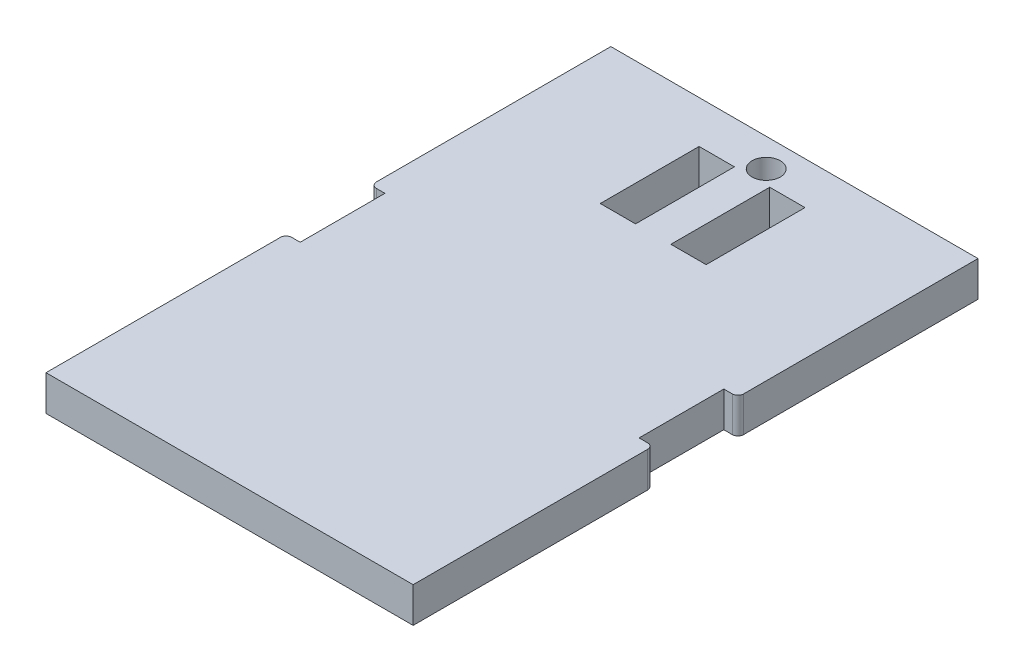
ISO-10303-21;
HEADER;
FILE_DESCRIPTION(('STEP AP214'),'2;1');
FILE_NAME('part.step','',(''),(''),'','','');
FILE_SCHEMA(('AUTOMOTIVE_DESIGN { 1 0 10303 214 1 1 1 1 }'));
ENDSEC;
DATA;
#1=APPLICATION_CONTEXT('core data for automotive mechanical design processes');
#2=APPLICATION_PROTOCOL_DEFINITION('international standard','automotive_design',2000,#1);
#3=PRODUCT_CONTEXT('',#1,'mechanical');
#4=PRODUCT('Part','Part','',(#3));
#5=PRODUCT_RELATED_PRODUCT_CATEGORY('part','',(#4));
#6=PRODUCT_DEFINITION_FORMATION('','',#4);
#7=PRODUCT_DEFINITION_CONTEXT('part definition',#1,'design');
#8=PRODUCT_DEFINITION('design','',#6,#7);
#9=PRODUCT_DEFINITION_SHAPE('','',#8);
#10=(LENGTH_UNIT() NAMED_UNIT(*) SI_UNIT(.MILLI.,.METRE.));
#11=(NAMED_UNIT(*) PLANE_ANGLE_UNIT() SI_UNIT($,.RADIAN.));
#12=(NAMED_UNIT(*) SI_UNIT($,.STERADIAN.) SOLID_ANGLE_UNIT());
#13=UNCERTAINTY_MEASURE_WITH_UNIT(LENGTH_MEASURE(1.E-05),#10,'distance_accuracy_value','');
#14=(GEOMETRIC_REPRESENTATION_CONTEXT(3) GLOBAL_UNCERTAINTY_ASSIGNED_CONTEXT((#13)) GLOBAL_UNIT_ASSIGNED_CONTEXT((#10,
#11,#12)) REPRESENTATION_CONTEXT('',''));
#15=CARTESIAN_POINT('',(0.,0.,0.));
#16=DIRECTION('',(0.,0.,1.));
#17=DIRECTION('',(1.,0.,0.));
#18=AXIS2_PLACEMENT_3D('',#15,#16,#17);
#19=CARTESIAN_POINT('',(33.02,3.175,0.));
#20=DIRECTION('',(-1.,0.,0.));
#21=DIRECTION('',(0.,0.,1.));
#22=AXIS2_PLACEMENT_3D('',#19,#20,#21);
#23=PLANE('',#22);
#24=DIRECTION('',(0.,0.,-1.));
#25=VECTOR('',#24,1.);
#26=CARTESIAN_POINT('',(33.02,0.,0.));
#27=LINE('',#26,#25);
#28=CARTESIAN_POINT('',(33.02,0.,0.));
#29=VERTEX_POINT('',#28);
#30=CARTESIAN_POINT('',(33.02,0.,-21.082));
#31=VERTEX_POINT('',#30);
#32=EDGE_CURVE('E344',#29,#31,#27,.T.);
#33=ORIENTED_EDGE('',*,*,#32,.T.);
#34=DIRECTION('',(0.,1.,0.));
#35=VECTOR('',#34,1.);
#36=CARTESIAN_POINT('',(33.02,3.175,-21.082));
#37=LINE('',#36,#35);
#38=CARTESIAN_POINT('',(33.02,3.175,-21.082));
#39=VERTEX_POINT('',#38);
#40=EDGE_CURVE('E360',#31,#39,#37,.T.);
#41=ORIENTED_EDGE('',*,*,#40,.T.);
#42=DIRECTION('',(0.,0.,-1.));
#43=VECTOR('',#42,1.);
#44=CARTESIAN_POINT('',(33.02,3.175,0.));
#45=LINE('',#44,#43);
#46=CARTESIAN_POINT('',(33.02,3.175,0.));
#47=VERTEX_POINT('',#46);
#48=EDGE_CURVE('E333',#47,#39,#45,.T.);
#49=ORIENTED_EDGE('',*,*,#48,.F.);
#50=DIRECTION('',(0.,-1.,0.));
#51=VECTOR('',#50,1.);
#52=CARTESIAN_POINT('',(33.02,3.175,0.));
#53=LINE('',#52,#51);
#54=EDGE_CURVE('E354',#47,#29,#53,.T.);
#55=ORIENTED_EDGE('',*,*,#54,.T.);
#56=EDGE_LOOP('',(#33,#41,#49,#55));
#57=FACE_BOUND('',#56,.T.);
#58=ADVANCED_FACE('F39',(#57),#23,.F.);
#59=CARTESIAN_POINT('',(0.,3.175,0.));
#60=DIRECTION('',(0.,-1.,0.));
#61=DIRECTION('',(0.,0.,-1.));
#62=AXIS2_PLACEMENT_3D('',#59,#60,#61);
#63=PLANE('',#62);
#64=ORIENTED_EDGE('',*,*,#48,.T.);
#65=CARTESIAN_POINT('',(32.512,3.175,-21.082));
#66=DIRECTION('',(0.,-1.,0.));
#67=DIRECTION('',(0.,0.,-1.));
#68=AXIS2_PLACEMENT_3D('',#65,#66,#67);
#69=CIRCLE('',#68,0.508);
#70=CARTESIAN_POINT('',(32.512,3.175,-21.59));
#71=VERTEX_POINT('',#70);
#72=EDGE_CURVE('E369',#39,#71,#69,.F.);
#73=ORIENTED_EDGE('',*,*,#72,.T.);
#74=DIRECTION('',(-1.,0.,0.));
#75=VECTOR('',#74,1.);
#76=CARTESIAN_POINT('',(33.02,3.175,-21.59));
#77=LINE('',#76,#75);
#78=CARTESIAN_POINT('',(31.75,3.175,-21.59));
#79=VERTEX_POINT('',#78);
#80=EDGE_CURVE('E213',#71,#79,#77,.T.);
#81=ORIENTED_EDGE('',*,*,#80,.T.);
#82=DIRECTION('',(0.,0.,1.));
#83=VECTOR('',#82,1.);
#84=CARTESIAN_POINT('',(31.75,3.175,-29.21));
#85=LINE('',#84,#83);
#86=CARTESIAN_POINT('',(31.75,3.175,-29.21));
#87=VERTEX_POINT('',#86);
#88=EDGE_CURVE('E233',#87,#79,#85,.T.);
#89=ORIENTED_EDGE('',*,*,#88,.F.);
#90=DIRECTION('',(-1.,0.,0.));
#91=VECTOR('',#90,1.);
#92=CARTESIAN_POINT('',(33.02,3.175,-29.21));
#93=LINE('',#92,#91);
#94=CARTESIAN_POINT('',(32.512,3.175,-29.21));
#95=VERTEX_POINT('',#94);
#96=EDGE_CURVE('E219',#95,#87,#93,.T.);
#97=ORIENTED_EDGE('',*,*,#96,.F.);
#98=CARTESIAN_POINT('',(32.512,3.175,-29.718));
#99=DIRECTION('',(0.,-1.,0.));
#100=DIRECTION('',(0.,0.,-1.));
#101=AXIS2_PLACEMENT_3D('',#98,#99,#100);
#102=CIRCLE('',#101,0.508);
#103=CARTESIAN_POINT('',(33.02,3.175,-29.718));
#104=VERTEX_POINT('',#103);
#105=EDGE_CURVE('E367',#95,#104,#102,.F.);
#106=ORIENTED_EDGE('',*,*,#105,.T.);
#107=CARTESIAN_POINT('',(33.02,3.175,-50.8));
#108=VERTEX_POINT('',#107);
#109=EDGE_CURVE('E332',#104,#108,#45,.T.);
#110=ORIENTED_EDGE('',*,*,#109,.T.);
#111=DIRECTION('',(-1.,0.,0.));
#112=VECTOR('',#111,1.);
#113=CARTESIAN_POINT('',(0.,3.175,-50.8));
#114=LINE('',#113,#112);
#115=CARTESIAN_POINT('',(0.,3.175,-50.8));
#116=VERTEX_POINT('',#115);
#117=EDGE_CURVE('E336',#108,#116,#114,.T.);
#118=ORIENTED_EDGE('',*,*,#117,.T.);
#119=DIRECTION('',(0.,0.,1.));
#120=VECTOR('',#119,1.);
#121=CARTESIAN_POINT('',(0.,3.175,0.));
#122=LINE('',#121,#120);
#123=CARTESIAN_POINT('',(0.,3.175,-29.718));
#124=VERTEX_POINT('',#123);
#125=EDGE_CURVE('E326',#116,#124,#122,.T.);
#126=ORIENTED_EDGE('',*,*,#125,.T.);
#127=CARTESIAN_POINT('',(0.508,3.175,-29.718));
#128=DIRECTION('',(0.,-1.,0.));
#129=DIRECTION('',(0.,0.,-1.));
#130=AXIS2_PLACEMENT_3D('',#127,#128,#129);
#131=CIRCLE('',#130,0.508);
#132=CARTESIAN_POINT('',(0.508,3.175,-29.21));
#133=VERTEX_POINT('',#132);
#134=EDGE_CURVE('E363',#124,#133,#131,.F.);
#135=ORIENTED_EDGE('',*,*,#134,.T.);
#136=DIRECTION('',(1.,0.,0.));
#137=VECTOR('',#136,1.);
#138=CARTESIAN_POINT('',(0.,3.175,-29.21));
#139=LINE('',#138,#137);
#140=CARTESIAN_POINT('',(1.27,3.175,-29.21));
#141=VERTEX_POINT('',#140);
#142=EDGE_CURVE('E236',#133,#141,#139,.T.);
#143=ORIENTED_EDGE('',*,*,#142,.T.);
#144=DIRECTION('',(0.,0.,1.));
#145=VECTOR('',#144,1.);
#146=CARTESIAN_POINT('',(1.27,3.175,-29.21));
#147=LINE('',#146,#145);
#148=CARTESIAN_POINT('',(1.27,3.175,-21.59));
#149=VERTEX_POINT('',#148);
#150=EDGE_CURVE('E248',#141,#149,#147,.T.);
#151=ORIENTED_EDGE('',*,*,#150,.T.);
#152=DIRECTION('',(1.,0.,0.));
#153=VECTOR('',#152,1.);
#154=CARTESIAN_POINT('',(0.,3.175,-21.59));
#155=LINE('',#154,#153);
#156=CARTESIAN_POINT('',(0.508,3.175,-21.59));
#157=VERTEX_POINT('',#156);
#158=EDGE_CURVE('E241',#157,#149,#155,.T.);
#159=ORIENTED_EDGE('',*,*,#158,.F.);
#160=CARTESIAN_POINT('',(0.508,3.175,-21.082));
#161=DIRECTION('',(0.,-1.,0.));
#162=DIRECTION('',(0.,0.,-1.));
#163=AXIS2_PLACEMENT_3D('',#160,#161,#162);
#164=CIRCLE('',#163,0.508);
#165=CARTESIAN_POINT('',(0.,3.175,-21.082));
#166=VERTEX_POINT('',#165);
#167=EDGE_CURVE('E365',#157,#166,#164,.F.);
#168=ORIENTED_EDGE('',*,*,#167,.T.);
#169=CARTESIAN_POINT('',(0.,3.175,0.));
#170=VERTEX_POINT('',#169);
#171=EDGE_CURVE('E330',#166,#170,#122,.T.);
#172=ORIENTED_EDGE('',*,*,#171,.T.);
#173=DIRECTION('',(1.,0.,0.));
#174=VECTOR('',#173,1.);
#175=CARTESIAN_POINT('',(0.,3.175,0.));
#176=LINE('',#175,#174);
#177=EDGE_CURVE('E329',#170,#47,#176,.T.);
#178=ORIENTED_EDGE('',*,*,#177,.T.);
#179=EDGE_LOOP('',(#64,#73,#81,#89,#97,#106,#110,#118,#126,#135,#143,#151,#159,#168,#172,#178));
#180=FACE_BOUND('',#179,.T.);
#181=DIRECTION('',(0.,0.,1.));
#182=VECTOR('',#181,1.);
#183=CARTESIAN_POINT('',(18.0975,3.175,-46.99));
#184=LINE('',#183,#182);
#185=CARTESIAN_POINT('',(18.0975,3.175,-46.99));
#186=VERTEX_POINT('',#185);
#187=CARTESIAN_POINT('',(18.0975,3.175,-38.1));
#188=VERTEX_POINT('',#187);
#189=EDGE_CURVE('E264',#186,#188,#184,.T.);
#190=ORIENTED_EDGE('',*,*,#189,.F.);
#191=DIRECTION('',(-1.,0.,0.));
#192=VECTOR('',#191,1.);
#193=CARTESIAN_POINT('',(18.0975,3.175,-46.99));
#194=LINE('',#193,#192);
#195=CARTESIAN_POINT('',(21.2725,3.175,-46.99));
#196=VERTEX_POINT('',#195);
#197=EDGE_CURVE('E272',#196,#186,#194,.T.);
#198=ORIENTED_EDGE('',*,*,#197,.F.);
#199=DIRECTION('',(0.,0.,-1.));
#200=VECTOR('',#199,1.);
#201=CARTESIAN_POINT('',(21.2725,3.175,-46.99));
#202=LINE('',#201,#200);
#203=CARTESIAN_POINT('',(21.2725,3.175,-38.1));
#204=VERTEX_POINT('',#203);
#205=EDGE_CURVE('E269',#204,#196,#202,.T.);
#206=ORIENTED_EDGE('',*,*,#205,.F.);
#207=DIRECTION('',(1.,0.,0.));
#208=VECTOR('',#207,1.);
#209=CARTESIAN_POINT('',(18.0975,3.175,-38.1));
#210=LINE('',#209,#208);
#211=EDGE_CURVE('E266',#188,#204,#210,.T.);
#212=ORIENTED_EDGE('',*,*,#211,.F.);
#213=EDGE_LOOP('',(#190,#198,#206,#212));
#214=FACE_BOUND('',#213,.T.);
#215=DIRECTION('',(0.,0.,1.));
#216=VECTOR('',#215,1.);
#217=CARTESIAN_POINT('',(11.7475,3.175,-46.99));
#218=LINE('',#217,#216);
#219=CARTESIAN_POINT('',(11.7475,3.175,-46.99));
#220=VERTEX_POINT('',#219);
#221=CARTESIAN_POINT('',(11.7475,3.175,-38.1));
#222=VERTEX_POINT('',#221);
#223=EDGE_CURVE('E295',#220,#222,#218,.T.);
#224=ORIENTED_EDGE('',*,*,#223,.F.);
#225=DIRECTION('',(-1.,0.,0.));
#226=VECTOR('',#225,1.);
#227=CARTESIAN_POINT('',(11.7475,3.175,-46.99));
#228=LINE('',#227,#226);
#229=CARTESIAN_POINT('',(14.9225,3.175,-46.99));
#230=VERTEX_POINT('',#229);
#231=EDGE_CURVE('E303',#230,#220,#228,.T.);
#232=ORIENTED_EDGE('',*,*,#231,.F.);
#233=DIRECTION('',(0.,0.,-1.));
#234=VECTOR('',#233,1.);
#235=CARTESIAN_POINT('',(14.9225,3.175,-46.99));
#236=LINE('',#235,#234);
#237=CARTESIAN_POINT('',(14.9225,3.175,-38.1));
#238=VERTEX_POINT('',#237);
#239=EDGE_CURVE('E300',#238,#230,#236,.T.);
#240=ORIENTED_EDGE('',*,*,#239,.F.);
#241=DIRECTION('',(1.,0.,0.));
#242=VECTOR('',#241,1.);
#243=CARTESIAN_POINT('',(11.7475,3.175,-38.1));
#244=LINE('',#243,#242);
#245=EDGE_CURVE('E297',#222,#238,#244,.T.);
#246=ORIENTED_EDGE('',*,*,#245,.F.);
#247=EDGE_LOOP('',(#224,#232,#240,#246));
#248=FACE_BOUND('',#247,.T.);
#249=CARTESIAN_POINT('',(16.51,3.175,-48.26));
#250=DIRECTION('',(0.,1.,0.));
#251=DIRECTION('',(0.,0.,1.));
#252=AXIS2_PLACEMENT_3D('',#249,#250,#251);
#253=CIRCLE('',#252,1.27);
#254=CARTESIAN_POINT('',(16.51,3.175,-46.99));
#255=VERTEX_POINT('',#254);
#256=EDGE_CURVE('E257',#255,#255,#253,.T.);
#257=ORIENTED_EDGE('',*,*,#256,.F.);
#258=EDGE_LOOP('',(#257));
#259=FACE_BOUND('',#258,.T.);
#260=ADVANCED_FACE('F393',(#180,#214,#248,#259),#63,.F.);
#261=CARTESIAN_POINT('',(0.,0.,0.));
#262=DIRECTION('',(0.,-1.,0.));
#263=DIRECTION('',(0.,0.,-1.));
#264=AXIS2_PLACEMENT_3D('',#261,#262,#263);
#265=PLANE('',#264);
#266=DIRECTION('',(-1.,0.,0.));
#267=VECTOR('',#266,1.);
#268=CARTESIAN_POINT('',(33.02,0.,-21.59));
#269=LINE('',#268,#267);
#270=CARTESIAN_POINT('',(32.512,0.,-21.59));
#271=VERTEX_POINT('',#270);
#272=CARTESIAN_POINT('',(31.75,0.,-21.59));
#273=VERTEX_POINT('',#272);
#274=EDGE_CURVE('E224',#271,#273,#269,.T.);
#275=ORIENTED_EDGE('',*,*,#274,.F.);
#276=CARTESIAN_POINT('',(32.512,0.,-21.082));
#277=DIRECTION('',(0.,-1.,0.));
#278=DIRECTION('',(0.,0.,-1.));
#279=AXIS2_PLACEMENT_3D('',#276,#277,#278);
#280=CIRCLE('',#279,0.508);
#281=EDGE_CURVE('E377',#271,#31,#280,.T.);
#282=ORIENTED_EDGE('',*,*,#281,.T.);
#283=ORIENTED_EDGE('',*,*,#32,.F.);
#284=DIRECTION('',(1.,0.,0.));
#285=VECTOR('',#284,1.);
#286=CARTESIAN_POINT('',(0.,0.,0.));
#287=LINE('',#286,#285);
#288=CARTESIAN_POINT('',(0.,0.,0.));
#289=VERTEX_POINT('',#288);
#290=EDGE_CURVE('E341',#289,#29,#287,.T.);
#291=ORIENTED_EDGE('',*,*,#290,.F.);
#292=DIRECTION('',(0.,0.,1.));
#293=VECTOR('',#292,1.);
#294=CARTESIAN_POINT('',(0.,0.,0.));
#295=LINE('',#294,#293);
#296=CARTESIAN_POINT('',(0.,0.,-21.082));
#297=VERTEX_POINT('',#296);
#298=EDGE_CURVE('E325',#297,#289,#295,.T.);
#299=ORIENTED_EDGE('',*,*,#298,.F.);
#300=CARTESIAN_POINT('',(0.508,0.,-21.082));
#301=DIRECTION('',(0.,-1.,0.));
#302=DIRECTION('',(0.,0.,-1.));
#303=AXIS2_PLACEMENT_3D('',#300,#301,#302);
#304=CIRCLE('',#303,0.508);
#305=CARTESIAN_POINT('',(0.508,0.,-21.59));
#306=VERTEX_POINT('',#305);
#307=EDGE_CURVE('E374',#297,#306,#304,.T.);
#308=ORIENTED_EDGE('',*,*,#307,.T.);
#309=DIRECTION('',(1.,0.,0.));
#310=VECTOR('',#309,1.);
#311=CARTESIAN_POINT('',(0.,0.,-21.59));
#312=LINE('',#311,#310);
#313=CARTESIAN_POINT('',(1.27,0.,-21.59));
#314=VERTEX_POINT('',#313);
#315=EDGE_CURVE('E244',#306,#314,#312,.T.);
#316=ORIENTED_EDGE('',*,*,#315,.T.);
#317=DIRECTION('',(0.,0.,1.));
#318=VECTOR('',#317,1.);
#319=CARTESIAN_POINT('',(1.27,0.,-29.21));
#320=LINE('',#319,#318);
#321=CARTESIAN_POINT('',(1.27,0.,-29.21));
#322=VERTEX_POINT('',#321);
#323=EDGE_CURVE('E240',#322,#314,#320,.T.);
#324=ORIENTED_EDGE('',*,*,#323,.F.);
#325=DIRECTION('',(1.,0.,0.));
#326=VECTOR('',#325,1.);
#327=CARTESIAN_POINT('',(0.,0.,-29.21));
#328=LINE('',#327,#326);
#329=CARTESIAN_POINT('',(0.508,0.,-29.21));
#330=VERTEX_POINT('',#329);
#331=EDGE_CURVE('E238',#330,#322,#328,.T.);
#332=ORIENTED_EDGE('',*,*,#331,.F.);
#333=CARTESIAN_POINT('',(0.508,0.,-29.718));
#334=DIRECTION('',(0.,-1.,0.));
#335=DIRECTION('',(0.,0.,-1.));
#336=AXIS2_PLACEMENT_3D('',#333,#334,#335);
#337=CIRCLE('',#336,0.508);
#338=CARTESIAN_POINT('',(0.,0.,-29.718));
#339=VERTEX_POINT('',#338);
#340=EDGE_CURVE('E62',#330,#339,#337,.T.);
#341=ORIENTED_EDGE('',*,*,#340,.T.);
#342=CARTESIAN_POINT('',(0.,0.,-50.8));
#343=VERTEX_POINT('',#342);
#344=EDGE_CURVE('E339',#343,#339,#295,.T.);
#345=ORIENTED_EDGE('',*,*,#344,.F.);
#346=DIRECTION('',(-1.,0.,0.));
#347=VECTOR('',#346,1.);
#348=CARTESIAN_POINT('',(0.,0.,-50.8));
#349=LINE('',#348,#347);
#350=CARTESIAN_POINT('',(33.02,0.,-50.8));
#351=VERTEX_POINT('',#350);
#352=EDGE_CURVE('E347',#351,#343,#349,.T.);
#353=ORIENTED_EDGE('',*,*,#352,.F.);
#354=CARTESIAN_POINT('',(33.02,0.,-29.718));
#355=VERTEX_POINT('',#354);
#356=EDGE_CURVE('E343',#355,#351,#27,.T.);
#357=ORIENTED_EDGE('',*,*,#356,.F.);
#358=CARTESIAN_POINT('',(32.512,0.,-29.718));
#359=DIRECTION('',(0.,-1.,0.));
#360=DIRECTION('',(0.,0.,-1.));
#361=AXIS2_PLACEMENT_3D('',#358,#359,#360);
#362=CIRCLE('',#361,0.508);
#363=CARTESIAN_POINT('',(32.512,0.,-29.21));
#364=VERTEX_POINT('',#363);
#365=EDGE_CURVE('E209',#355,#364,#362,.T.);
#366=ORIENTED_EDGE('',*,*,#365,.T.);
#367=DIRECTION('',(-1.,0.,0.));
#368=VECTOR('',#367,1.);
#369=CARTESIAN_POINT('',(33.02,0.,-29.21));
#370=LINE('',#369,#368);
#371=CARTESIAN_POINT('',(31.75,0.,-29.21));
#372=VERTEX_POINT('',#371);
#373=EDGE_CURVE('E201',#364,#372,#370,.T.);
#374=ORIENTED_EDGE('',*,*,#373,.T.);
#375=DIRECTION('',(0.,0.,1.));
#376=VECTOR('',#375,1.);
#377=CARTESIAN_POINT('',(31.75,0.,-29.21));
#378=LINE('',#377,#376);
#379=EDGE_CURVE('E207',#372,#273,#378,.T.);
#380=ORIENTED_EDGE('',*,*,#379,.T.);
#381=EDGE_LOOP('',(#275,#282,#283,#291,#299,#308,#316,#324,#332,#341,#345,#353,#357,#366,#374,#380));
#382=FACE_BOUND('',#381,.T.);
#383=CARTESIAN_POINT('',(16.51,0.,-48.26));
#384=DIRECTION('',(0.,1.,0.));
#385=DIRECTION('',(0.,0.,1.));
#386=AXIS2_PLACEMENT_3D('',#383,#384,#385);
#387=CIRCLE('',#386,1.27);
#388=CARTESIAN_POINT('',(16.51,0.,-46.99));
#389=VERTEX_POINT('',#388);
#390=EDGE_CURVE('E258',#389,#389,#387,.T.);
#391=ORIENTED_EDGE('',*,*,#390,.T.);
#392=EDGE_LOOP('',(#391));
#393=FACE_BOUND('',#392,.T.);
#394=DIRECTION('',(-1.,0.,0.));
#395=VECTOR('',#394,1.);
#396=CARTESIAN_POINT('',(11.7475,0.,-46.99));
#397=LINE('',#396,#395);
#398=CARTESIAN_POINT('',(14.9225,0.,-46.99));
#399=VERTEX_POINT('',#398);
#400=CARTESIAN_POINT('',(11.7475,0.,-46.99));
#401=VERTEX_POINT('',#400);
#402=EDGE_CURVE('E298',#399,#401,#397,.T.);
#403=ORIENTED_EDGE('',*,*,#402,.T.);
#404=DIRECTION('',(0.,0.,1.));
#405=VECTOR('',#404,1.);
#406=CARTESIAN_POINT('',(11.7475,0.,-46.99));
#407=LINE('',#406,#405);
#408=CARTESIAN_POINT('',(11.7475,0.,-38.1));
#409=VERTEX_POINT('',#408);
#410=EDGE_CURVE('E294',#401,#409,#407,.T.);
#411=ORIENTED_EDGE('',*,*,#410,.T.);
#412=DIRECTION('',(1.,0.,0.));
#413=VECTOR('',#412,1.);
#414=CARTESIAN_POINT('',(11.7475,0.,-38.1));
#415=LINE('',#414,#413);
#416=CARTESIAN_POINT('',(14.9225,0.,-38.1));
#417=VERTEX_POINT('',#416);
#418=EDGE_CURVE('E308',#409,#417,#415,.T.);
#419=ORIENTED_EDGE('',*,*,#418,.T.);
#420=DIRECTION('',(0.,0.,-1.));
#421=VECTOR('',#420,1.);
#422=CARTESIAN_POINT('',(14.9225,0.,-46.99));
#423=LINE('',#422,#421);
#424=EDGE_CURVE('E311',#417,#399,#423,.T.);
#425=ORIENTED_EDGE('',*,*,#424,.T.);
#426=EDGE_LOOP('',(#403,#411,#419,#425));
#427=FACE_BOUND('',#426,.T.);
#428=DIRECTION('',(-1.,0.,0.));
#429=VECTOR('',#428,1.);
#430=CARTESIAN_POINT('',(18.0975,0.,-46.99));
#431=LINE('',#430,#429);
#432=CARTESIAN_POINT('',(21.2725,0.,-46.99));
#433=VERTEX_POINT('',#432);
#434=CARTESIAN_POINT('',(18.0975,0.,-46.99));
#435=VERTEX_POINT('',#434);
#436=EDGE_CURVE('E267',#433,#435,#431,.T.);
#437=ORIENTED_EDGE('',*,*,#436,.T.);
#438=DIRECTION('',(0.,0.,1.));
#439=VECTOR('',#438,1.);
#440=CARTESIAN_POINT('',(18.0975,0.,-46.99));
#441=LINE('',#440,#439);
#442=CARTESIAN_POINT('',(18.0975,0.,-38.1));
#443=VERTEX_POINT('',#442);
#444=EDGE_CURVE('E261',#435,#443,#441,.T.);
#445=ORIENTED_EDGE('',*,*,#444,.T.);
#446=DIRECTION('',(1.,0.,0.));
#447=VECTOR('',#446,1.);
#448=CARTESIAN_POINT('',(18.0975,0.,-38.1));
#449=LINE('',#448,#447);
#450=CARTESIAN_POINT('',(21.2725,0.,-38.1));
#451=VERTEX_POINT('',#450);
#452=EDGE_CURVE('E277',#443,#451,#449,.T.);
#453=ORIENTED_EDGE('',*,*,#452,.T.);
#454=DIRECTION('',(0.,0.,-1.));
#455=VECTOR('',#454,1.);
#456=CARTESIAN_POINT('',(21.2725,0.,-46.99));
#457=LINE('',#456,#455);
#458=EDGE_CURVE('E280',#451,#433,#457,.T.);
#459=ORIENTED_EDGE('',*,*,#458,.T.);
#460=EDGE_LOOP('',(#437,#445,#453,#459));
#461=FACE_BOUND('',#460,.T.);
#462=ADVANCED_FACE('F204',(#382,#393,#427,#461),#265,.T.);
#463=CARTESIAN_POINT('',(0.,3.175,0.));
#464=DIRECTION('',(1.,0.,0.));
#465=DIRECTION('',(0.,0.,-1.));
#466=AXIS2_PLACEMENT_3D('',#463,#464,#465);
#467=PLANE('',#466);
#468=ORIENTED_EDGE('',*,*,#344,.T.);
#469=DIRECTION('',(0.,1.,0.));
#470=VECTOR('',#469,1.);
#471=CARTESIAN_POINT('',(0.,3.175,-29.718));
#472=LINE('',#471,#470);
#473=EDGE_CURVE('E47',#339,#124,#472,.T.);
#474=ORIENTED_EDGE('',*,*,#473,.T.);
#475=ORIENTED_EDGE('',*,*,#125,.F.);
#476=DIRECTION('',(0.,-1.,0.));
#477=VECTOR('',#476,1.);
#478=CARTESIAN_POINT('',(0.,3.175,-50.8));
#479=LINE('',#478,#477);
#480=EDGE_CURVE('E338',#116,#343,#479,.T.);
#481=ORIENTED_EDGE('',*,*,#480,.T.);
#482=EDGE_LOOP('',(#468,#474,#475,#481));
#483=FACE_BOUND('',#482,.T.);
#484=ADVANCED_FACE('F390',(#483),#467,.F.);
#485=ORIENTED_EDGE('',*,*,#171,.F.);
#486=DIRECTION('',(0.,1.,0.));
#487=VECTOR('',#486,1.);
#488=CARTESIAN_POINT('',(0.,3.175,-21.082));
#489=LINE('',#488,#487);
#490=EDGE_CURVE('E385',#166,#297,#489,.F.);
#491=ORIENTED_EDGE('',*,*,#490,.T.);
#492=ORIENTED_EDGE('',*,*,#298,.T.);
#493=DIRECTION('',(0.,-1.,0.));
#494=VECTOR('',#493,1.);
#495=CARTESIAN_POINT('',(0.,3.175,0.));
#496=LINE('',#495,#494);
#497=EDGE_CURVE('E357',#170,#289,#496,.T.);
#498=ORIENTED_EDGE('',*,*,#497,.F.);
#499=EDGE_LOOP('',(#485,#491,#492,#498));
#500=FACE_BOUND('',#499,.T.);
#501=ADVANCED_FACE('F425',(#500),#467,.F.);
#502=CARTESIAN_POINT('',(0.,3.175,0.));
#503=DIRECTION('',(0.,0.,-1.));
#504=DIRECTION('',(-1.,0.,0.));
#505=AXIS2_PLACEMENT_3D('',#502,#503,#504);
#506=PLANE('',#505);
#507=ORIENTED_EDGE('',*,*,#290,.T.);
#508=ORIENTED_EDGE('',*,*,#54,.F.);
#509=ORIENTED_EDGE('',*,*,#177,.F.);
#510=ORIENTED_EDGE('',*,*,#497,.T.);
#511=EDGE_LOOP('',(#507,#508,#509,#510));
#512=FACE_BOUND('',#511,.T.);
#513=ADVANCED_FACE('F420',(#512),#506,.F.);
#514=ORIENTED_EDGE('',*,*,#109,.F.);
#515=DIRECTION('',(0.,1.,0.));
#516=VECTOR('',#515,1.);
#517=CARTESIAN_POINT('',(33.02,3.175,-29.718));
#518=LINE('',#517,#516);
#519=EDGE_CURVE('E54',#104,#355,#518,.F.);
#520=ORIENTED_EDGE('',*,*,#519,.T.);
#521=ORIENTED_EDGE('',*,*,#356,.T.);
#522=DIRECTION('',(0.,-1.,0.));
#523=VECTOR('',#522,1.);
#524=CARTESIAN_POINT('',(33.02,3.175,-50.8));
#525=LINE('',#524,#523);
#526=EDGE_CURVE('E351',#108,#351,#525,.T.);
#527=ORIENTED_EDGE('',*,*,#526,.F.);
#528=EDGE_LOOP('',(#514,#520,#521,#527));
#529=FACE_BOUND('',#528,.T.);
#530=ADVANCED_FACE('F449',(#529),#23,.F.);
#531=CARTESIAN_POINT('',(0.,3.175,-50.8));
#532=DIRECTION('',(0.,0.,1.));
#533=DIRECTION('',(1.,0.,0.));
#534=AXIS2_PLACEMENT_3D('',#531,#532,#533);
#535=PLANE('',#534);
#536=ORIENTED_EDGE('',*,*,#352,.T.);
#537=ORIENTED_EDGE('',*,*,#480,.F.);
#538=ORIENTED_EDGE('',*,*,#117,.F.);
#539=ORIENTED_EDGE('',*,*,#526,.T.);
#540=EDGE_LOOP('',(#536,#537,#538,#539));
#541=FACE_BOUND('',#540,.T.);
#542=ADVANCED_FACE('F400',(#541),#535,.F.);
#543=CARTESIAN_POINT('',(11.7475,3.175,-46.99));
#544=DIRECTION('',(1.,0.,0.));
#545=DIRECTION('',(0.,0.,-1.));
#546=AXIS2_PLACEMENT_3D('',#543,#544,#545);
#547=PLANE('',#546);
#548=ORIENTED_EDGE('',*,*,#410,.F.);
#549=DIRECTION('',(0.,-1.,0.));
#550=VECTOR('',#549,1.);
#551=CARTESIAN_POINT('',(11.7475,3.175,-46.99));
#552=LINE('',#551,#550);
#553=EDGE_CURVE('E305',#220,#401,#552,.T.);
#554=ORIENTED_EDGE('',*,*,#553,.F.);
#555=ORIENTED_EDGE('',*,*,#223,.T.);
#556=DIRECTION('',(0.,-1.,0.));
#557=VECTOR('',#556,1.);
#558=CARTESIAN_POINT('',(11.7475,3.175,-38.1));
#559=LINE('',#558,#557);
#560=EDGE_CURVE('E322',#222,#409,#559,.T.);
#561=ORIENTED_EDGE('',*,*,#560,.T.);
#562=EDGE_LOOP('',(#548,#554,#555,#561));
#563=FACE_BOUND('',#562,.T.);
#564=ADVANCED_FACE('F463',(#563),#547,.T.);
#565=CARTESIAN_POINT('',(11.7475,3.175,-38.1));
#566=DIRECTION('',(0.,0.,-1.));
#567=DIRECTION('',(-1.,0.,0.));
#568=AXIS2_PLACEMENT_3D('',#565,#566,#567);
#569=PLANE('',#568);
#570=ORIENTED_EDGE('',*,*,#418,.F.);
#571=ORIENTED_EDGE('',*,*,#560,.F.);
#572=ORIENTED_EDGE('',*,*,#245,.T.);
#573=DIRECTION('',(0.,-1.,0.));
#574=VECTOR('',#573,1.);
#575=CARTESIAN_POINT('',(14.9225,3.175,-38.1));
#576=LINE('',#575,#574);
#577=EDGE_CURVE('E320',#238,#417,#576,.T.);
#578=ORIENTED_EDGE('',*,*,#577,.T.);
#579=EDGE_LOOP('',(#570,#571,#572,#578));
#580=FACE_BOUND('',#579,.T.);
#581=ADVANCED_FACE('F618',(#580),#569,.T.);
#582=CARTESIAN_POINT('',(14.9225,3.175,-46.99));
#583=DIRECTION('',(-1.,0.,0.));
#584=DIRECTION('',(0.,0.,1.));
#585=AXIS2_PLACEMENT_3D('',#582,#583,#584);
#586=PLANE('',#585);
#587=ORIENTED_EDGE('',*,*,#424,.F.);
#588=ORIENTED_EDGE('',*,*,#577,.F.);
#589=ORIENTED_EDGE('',*,*,#239,.T.);
#590=DIRECTION('',(0.,-1.,0.));
#591=VECTOR('',#590,1.);
#592=CARTESIAN_POINT('',(14.9225,3.175,-46.99));
#593=LINE('',#592,#591);
#594=EDGE_CURVE('E318',#230,#399,#593,.T.);
#595=ORIENTED_EDGE('',*,*,#594,.T.);
#596=EDGE_LOOP('',(#587,#588,#589,#595));
#597=FACE_BOUND('',#596,.T.);
#598=ADVANCED_FACE('F609',(#597),#586,.T.);
#599=CARTESIAN_POINT('',(11.7475,3.175,-46.99));
#600=DIRECTION('',(0.,0.,1.));
#601=DIRECTION('',(1.,0.,0.));
#602=AXIS2_PLACEMENT_3D('',#599,#600,#601);
#603=PLANE('',#602);
#604=ORIENTED_EDGE('',*,*,#402,.F.);
#605=ORIENTED_EDGE('',*,*,#594,.F.);
#606=ORIENTED_EDGE('',*,*,#231,.T.);
#607=ORIENTED_EDGE('',*,*,#553,.T.);
#608=EDGE_LOOP('',(#604,#605,#606,#607));
#609=FACE_BOUND('',#608,.T.);
#610=ADVANCED_FACE('F600',(#609),#603,.T.);
#611=CARTESIAN_POINT('',(18.0975,3.175,-46.99));
#612=DIRECTION('',(1.,0.,0.));
#613=DIRECTION('',(0.,0.,-1.));
#614=AXIS2_PLACEMENT_3D('',#611,#612,#613);
#615=PLANE('',#614);
#616=ORIENTED_EDGE('',*,*,#444,.F.);
#617=DIRECTION('',(0.,-1.,0.));
#618=VECTOR('',#617,1.);
#619=CARTESIAN_POINT('',(18.0975,3.175,-46.99));
#620=LINE('',#619,#618);
#621=EDGE_CURVE('E274',#186,#435,#620,.T.);
#622=ORIENTED_EDGE('',*,*,#621,.F.);
#623=ORIENTED_EDGE('',*,*,#189,.T.);
#624=DIRECTION('',(0.,-1.,0.));
#625=VECTOR('',#624,1.);
#626=CARTESIAN_POINT('',(18.0975,3.175,-38.1));
#627=LINE('',#626,#625);
#628=EDGE_CURVE('E291',#188,#443,#627,.T.);
#629=ORIENTED_EDGE('',*,*,#628,.T.);
#630=EDGE_LOOP('',(#616,#622,#623,#629));
#631=FACE_BOUND('',#630,.T.);
#632=ADVANCED_FACE('F591',(#631),#615,.T.);
#633=CARTESIAN_POINT('',(18.0975,3.175,-38.1));
#634=DIRECTION('',(0.,0.,-1.));
#635=DIRECTION('',(-1.,0.,0.));
#636=AXIS2_PLACEMENT_3D('',#633,#634,#635);
#637=PLANE('',#636);
#638=ORIENTED_EDGE('',*,*,#452,.F.);
#639=ORIENTED_EDGE('',*,*,#628,.F.);
#640=ORIENTED_EDGE('',*,*,#211,.T.);
#641=DIRECTION('',(0.,-1.,0.));
#642=VECTOR('',#641,1.);
#643=CARTESIAN_POINT('',(21.2725,3.175,-38.1));
#644=LINE('',#643,#642);
#645=EDGE_CURVE('E289',#204,#451,#644,.T.);
#646=ORIENTED_EDGE('',*,*,#645,.T.);
#647=EDGE_LOOP('',(#638,#639,#640,#646));
#648=FACE_BOUND('',#647,.T.);
#649=ADVANCED_FACE('F582',(#648),#637,.T.);
#650=CARTESIAN_POINT('',(21.2725,3.175,-46.99));
#651=DIRECTION('',(-1.,0.,0.));
#652=DIRECTION('',(0.,0.,1.));
#653=AXIS2_PLACEMENT_3D('',#650,#651,#652);
#654=PLANE('',#653);
#655=ORIENTED_EDGE('',*,*,#458,.F.);
#656=ORIENTED_EDGE('',*,*,#645,.F.);
#657=ORIENTED_EDGE('',*,*,#205,.T.);
#658=DIRECTION('',(0.,-1.,0.));
#659=VECTOR('',#658,1.);
#660=CARTESIAN_POINT('',(21.2725,3.175,-46.99));
#661=LINE('',#660,#659);
#662=EDGE_CURVE('E287',#196,#433,#661,.T.);
#663=ORIENTED_EDGE('',*,*,#662,.T.);
#664=EDGE_LOOP('',(#655,#656,#657,#663));
#665=FACE_BOUND('',#664,.T.);
#666=ADVANCED_FACE('F573',(#665),#654,.T.);
#667=CARTESIAN_POINT('',(18.0975,3.175,-46.99));
#668=DIRECTION('',(0.,0.,1.));
#669=DIRECTION('',(1.,0.,0.));
#670=AXIS2_PLACEMENT_3D('',#667,#668,#669);
#671=PLANE('',#670);
#672=ORIENTED_EDGE('',*,*,#436,.F.);
#673=ORIENTED_EDGE('',*,*,#662,.F.);
#674=ORIENTED_EDGE('',*,*,#197,.T.);
#675=ORIENTED_EDGE('',*,*,#621,.T.);
#676=EDGE_LOOP('',(#672,#673,#674,#675));
#677=FACE_BOUND('',#676,.T.);
#678=ADVANCED_FACE('F564',(#677),#671,.T.);
#679=CARTESIAN_POINT('',(16.51,0.,-48.26));
#680=DIRECTION('',(0.,1.,0.));
#681=DIRECTION('',(0.,0.,1.));
#682=AXIS2_PLACEMENT_3D('',#679,#680,#681);
#683=CYLINDRICAL_SURFACE('',#682,1.27);
#684=ORIENTED_EDGE('',*,*,#390,.F.);
#685=EDGE_LOOP('',(#684));
#686=FACE_BOUND('',#685,.T.);
#687=ORIENTED_EDGE('',*,*,#256,.T.);
#688=EDGE_LOOP('',(#687));
#689=FACE_BOUND('',#688,.T.);
#690=ADVANCED_FACE('F536',(#686,#689),#683,.F.);
#691=CARTESIAN_POINT('',(0.,0.,-29.21));
#692=DIRECTION('',(0.,0.,1.));
#693=DIRECTION('',(1.,0.,0.));
#694=AXIS2_PLACEMENT_3D('',#691,#692,#693);
#695=PLANE('',#694);
#696=ORIENTED_EDGE('',*,*,#142,.F.);
#697=DIRECTION('',(0.,1.,0.));
#698=VECTOR('',#697,1.);
#699=CARTESIAN_POINT('',(0.508,0.,-29.21));
#700=LINE('',#699,#698);
#701=EDGE_CURVE('E11',#133,#330,#700,.F.);
#702=ORIENTED_EDGE('',*,*,#701,.T.);
#703=ORIENTED_EDGE('',*,*,#331,.T.);
#704=DIRECTION('',(0.,1.,0.));
#705=VECTOR('',#704,1.);
#706=CARTESIAN_POINT('',(1.27,0.,-29.21));
#707=LINE('',#706,#705);
#708=EDGE_CURVE('E254',#322,#141,#707,.T.);
#709=ORIENTED_EDGE('',*,*,#708,.T.);
#710=EDGE_LOOP('',(#696,#702,#703,#709));
#711=FACE_BOUND('',#710,.T.);
#712=ADVANCED_FACE('F442',(#711),#695,.T.);
#713=CARTESIAN_POINT('',(1.27,0.,-29.21));
#714=DIRECTION('',(-1.,0.,0.));
#715=DIRECTION('',(0.,0.,1.));
#716=AXIS2_PLACEMENT_3D('',#713,#714,#715);
#717=PLANE('',#716);
#718=ORIENTED_EDGE('',*,*,#150,.F.);
#719=ORIENTED_EDGE('',*,*,#708,.F.);
#720=ORIENTED_EDGE('',*,*,#323,.T.);
#721=DIRECTION('',(0.,1.,0.));
#722=VECTOR('',#721,1.);
#723=CARTESIAN_POINT('',(1.27,0.,-21.59));
#724=LINE('',#723,#722);
#725=EDGE_CURVE('E246',#314,#149,#724,.T.);
#726=ORIENTED_EDGE('',*,*,#725,.T.);
#727=EDGE_LOOP('',(#718,#719,#720,#726));
#728=FACE_BOUND('',#727,.T.);
#729=ADVANCED_FACE('F438',(#728),#717,.T.);
#730=CARTESIAN_POINT('',(0.,0.,-21.59));
#731=DIRECTION('',(0.,0.,1.));
#732=DIRECTION('',(1.,0.,0.));
#733=AXIS2_PLACEMENT_3D('',#730,#731,#732);
#734=PLANE('',#733);
#735=ORIENTED_EDGE('',*,*,#315,.F.);
#736=DIRECTION('',(0.,1.,0.));
#737=VECTOR('',#736,1.);
#738=CARTESIAN_POINT('',(0.508,0.,-21.59));
#739=LINE('',#738,#737);
#740=EDGE_CURVE('E382',#306,#157,#739,.T.);
#741=ORIENTED_EDGE('',*,*,#740,.T.);
#742=ORIENTED_EDGE('',*,*,#158,.T.);
#743=ORIENTED_EDGE('',*,*,#725,.F.);
#744=EDGE_LOOP('',(#735,#741,#742,#743));
#745=FACE_BOUND('',#744,.T.);
#746=ADVANCED_FACE('F434',(#745),#734,.F.);
#747=CARTESIAN_POINT('',(33.02,0.,-29.21));
#748=DIRECTION('',(0.,0.,-1.));
#749=DIRECTION('',(-1.,0.,0.));
#750=AXIS2_PLACEMENT_3D('',#747,#748,#749);
#751=PLANE('',#750);
#752=ORIENTED_EDGE('',*,*,#373,.F.);
#753=DIRECTION('',(0.,1.,0.));
#754=VECTOR('',#753,1.);
#755=CARTESIAN_POINT('',(32.512,0.,-29.21));
#756=LINE('',#755,#754);
#757=EDGE_CURVE('E379',#364,#95,#756,.T.);
#758=ORIENTED_EDGE('',*,*,#757,.T.);
#759=ORIENTED_EDGE('',*,*,#96,.T.);
#760=DIRECTION('',(0.,1.,0.));
#761=VECTOR('',#760,1.);
#762=CARTESIAN_POINT('',(31.75,0.,-29.21));
#763=LINE('',#762,#761);
#764=EDGE_CURVE('E216',#372,#87,#763,.T.);
#765=ORIENTED_EDGE('',*,*,#764,.F.);
#766=EDGE_LOOP('',(#752,#758,#759,#765));
#767=FACE_BOUND('',#766,.T.);
#768=ADVANCED_FACE('F217',(#767),#751,.F.);
#769=CARTESIAN_POINT('',(33.02,0.,-21.59));
#770=DIRECTION('',(0.,0.,-1.));
#771=DIRECTION('',(-1.,0.,0.));
#772=AXIS2_PLACEMENT_3D('',#769,#770,#771);
#773=PLANE('',#772);
#774=ORIENTED_EDGE('',*,*,#80,.F.);
#775=DIRECTION('',(0.,1.,0.));
#776=VECTOR('',#775,1.);
#777=CARTESIAN_POINT('',(32.512,0.,-21.59));
#778=LINE('',#777,#776);
#779=EDGE_CURVE('E371',#71,#271,#778,.F.);
#780=ORIENTED_EDGE('',*,*,#779,.T.);
#781=ORIENTED_EDGE('',*,*,#274,.T.);
#782=DIRECTION('',(0.,1.,0.));
#783=VECTOR('',#782,1.);
#784=CARTESIAN_POINT('',(31.75,0.,-21.59));
#785=LINE('',#784,#783);
#786=EDGE_CURVE('E223',#273,#79,#785,.T.);
#787=ORIENTED_EDGE('',*,*,#786,.T.);
#788=EDGE_LOOP('',(#774,#780,#781,#787));
#789=FACE_BOUND('',#788,.T.);
#790=ADVANCED_FACE('F407',(#789),#773,.T.);
#791=CARTESIAN_POINT('',(31.75,0.,-29.21));
#792=DIRECTION('',(-1.,0.,0.));
#793=DIRECTION('',(0.,0.,1.));
#794=AXIS2_PLACEMENT_3D('',#791,#792,#793);
#795=PLANE('',#794);
#796=ORIENTED_EDGE('',*,*,#88,.T.);
#797=ORIENTED_EDGE('',*,*,#786,.F.);
#798=ORIENTED_EDGE('',*,*,#379,.F.);
#799=ORIENTED_EDGE('',*,*,#764,.T.);
#800=EDGE_LOOP('',(#796,#797,#798,#799));
#801=FACE_BOUND('',#800,.T.);
#802=ADVANCED_FACE('F227',(#801),#795,.F.);
#803=CARTESIAN_POINT('',(32.512,3.175,-21.082));
#804=DIRECTION('',(0.,-1.,0.));
#805=DIRECTION('',(0.,0.,-1.));
#806=AXIS2_PLACEMENT_3D('',#803,#804,#805);
#807=CYLINDRICAL_SURFACE('',#806,0.508);
#808=ORIENTED_EDGE('',*,*,#281,.F.);
#809=ORIENTED_EDGE('',*,*,#779,.F.);
#810=ORIENTED_EDGE('',*,*,#72,.F.);
#811=ORIENTED_EDGE('',*,*,#40,.F.);
#812=EDGE_LOOP('',(#808,#809,#810,#811));
#813=FACE_BOUND('',#812,.T.);
#814=ADVANCED_FACE('F412',(#813),#807,.T.);
#815=CARTESIAN_POINT('',(32.512,0.,-29.718));
#816=DIRECTION('',(0.,1.,0.));
#817=DIRECTION('',(0.,0.,1.));
#818=AXIS2_PLACEMENT_3D('',#815,#816,#817);
#819=CYLINDRICAL_SURFACE('',#818,0.508);
#820=ORIENTED_EDGE('',*,*,#365,.F.);
#821=ORIENTED_EDGE('',*,*,#519,.F.);
#822=ORIENTED_EDGE('',*,*,#105,.F.);
#823=ORIENTED_EDGE('',*,*,#757,.F.);
#824=EDGE_LOOP('',(#820,#821,#822,#823));
#825=FACE_BOUND('',#824,.T.);
#826=ADVANCED_FACE('F403',(#825),#819,.T.);
#827=CARTESIAN_POINT('',(0.508,0.,-21.082));
#828=DIRECTION('',(0.,1.,0.));
#829=DIRECTION('',(0.,0.,1.));
#830=AXIS2_PLACEMENT_3D('',#827,#828,#829);
#831=CYLINDRICAL_SURFACE('',#830,0.508);
#832=ORIENTED_EDGE('',*,*,#307,.F.);
#833=ORIENTED_EDGE('',*,*,#490,.F.);
#834=ORIENTED_EDGE('',*,*,#167,.F.);
#835=ORIENTED_EDGE('',*,*,#740,.F.);
#836=EDGE_LOOP('',(#832,#833,#834,#835));
#837=FACE_BOUND('',#836,.T.);
#838=ADVANCED_FACE('F428',(#837),#831,.T.);
#839=CARTESIAN_POINT('',(0.508,3.175,-29.718));
#840=DIRECTION('',(0.,-1.,0.));
#841=DIRECTION('',(0.,0.,-1.));
#842=AXIS2_PLACEMENT_3D('',#839,#840,#841);
#843=CYLINDRICAL_SURFACE('',#842,0.508);
#844=ORIENTED_EDGE('',*,*,#340,.F.);
#845=ORIENTED_EDGE('',*,*,#701,.F.);
#846=ORIENTED_EDGE('',*,*,#134,.F.);
#847=ORIENTED_EDGE('',*,*,#473,.F.);
#848=EDGE_LOOP('',(#844,#845,#846,#847));
#849=FACE_BOUND('',#848,.T.);
#850=ADVANCED_FACE('F41',(#849),#843,.T.);
#851=CLOSED_SHELL('',(#58,#260,#462,#484,#501,#513,#530,#542,#564,#581,#598,#610,#632,#649,#666,
#678,#690,#712,#729,#746,#768,#790,#802,#814,#826,#838,#850));
#852=MANIFOLD_SOLID_BREP('B2',#851);
#853=ADVANCED_BREP_SHAPE_REPRESENTATION('',(#18,#852),#14);
#854=SHAPE_DEFINITION_REPRESENTATION(#9,#853);
ENDSEC;
END-ISO-10303-21;
